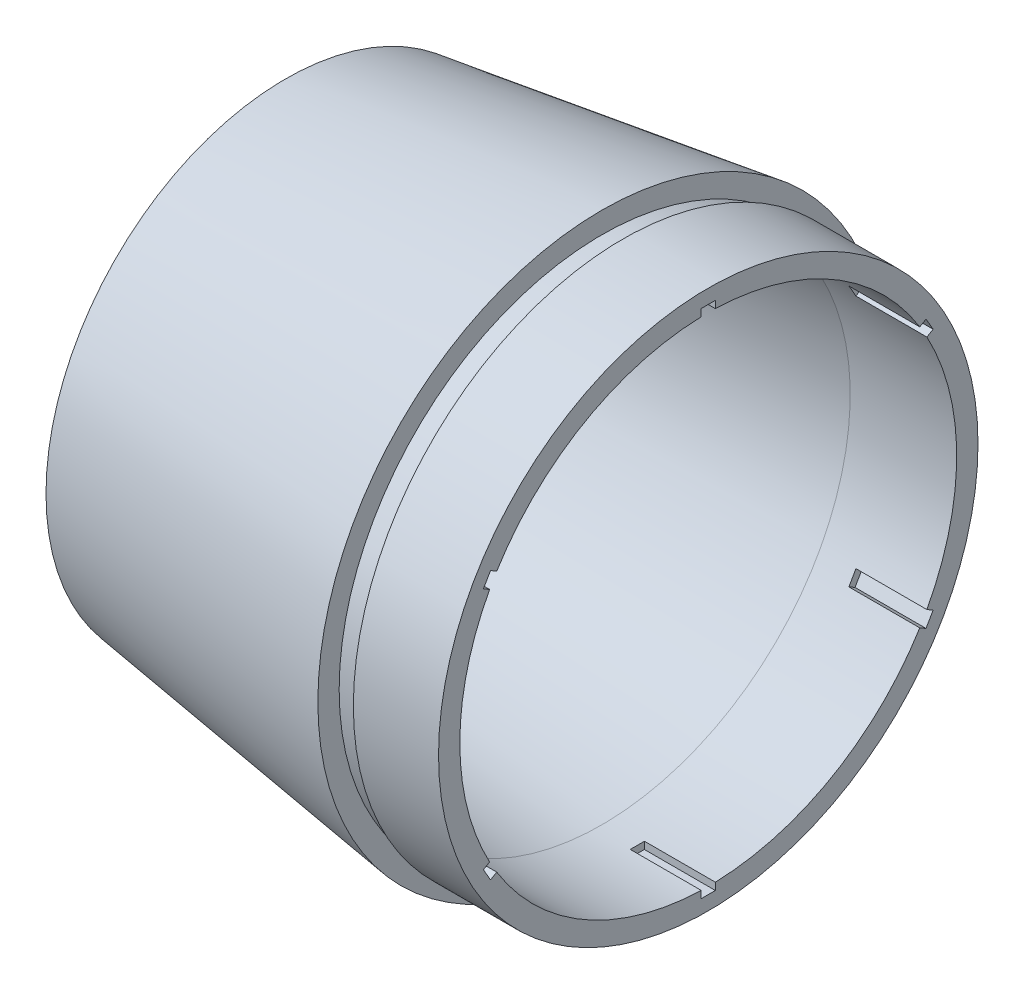
ISO-10303-21;
HEADER;
FILE_DESCRIPTION(('STEP AP214'),'2;1');
FILE_NAME('part.step','',(''),(''),'','','');
FILE_SCHEMA(('AUTOMOTIVE_DESIGN { 1 0 10303 214 1 1 1 1 }'));
ENDSEC;
DATA;
#1=APPLICATION_CONTEXT('core data for automotive mechanical design processes');
#2=APPLICATION_PROTOCOL_DEFINITION('international standard','automotive_design',2000,#1);
#3=PRODUCT_CONTEXT('',#1,'mechanical');
#4=PRODUCT('Part','Part','',(#3));
#5=PRODUCT_RELATED_PRODUCT_CATEGORY('part','',(#4));
#6=PRODUCT_DEFINITION_FORMATION('','',#4);
#7=PRODUCT_DEFINITION_CONTEXT('part definition',#1,'design');
#8=PRODUCT_DEFINITION('design','',#6,#7);
#9=PRODUCT_DEFINITION_SHAPE('','',#8);
#10=(LENGTH_UNIT() NAMED_UNIT(*) SI_UNIT(.MILLI.,.METRE.));
#11=(NAMED_UNIT(*) PLANE_ANGLE_UNIT() SI_UNIT($,.RADIAN.));
#12=(NAMED_UNIT(*) SI_UNIT($,.STERADIAN.) SOLID_ANGLE_UNIT());
#13=UNCERTAINTY_MEASURE_WITH_UNIT(LENGTH_MEASURE(1.E-05),#10,'distance_accuracy_value','');
#14=(GEOMETRIC_REPRESENTATION_CONTEXT(3) GLOBAL_UNCERTAINTY_ASSIGNED_CONTEXT((#13)) GLOBAL_UNIT_ASSIGNED_CONTEXT((#10,
#11,#12)) REPRESENTATION_CONTEXT('',''));
#15=CARTESIAN_POINT('',(0.,0.,0.));
#16=DIRECTION('',(0.,0.,1.));
#17=DIRECTION('',(1.,0.,0.));
#18=AXIS2_PLACEMENT_3D('',#15,#16,#17);
#19=CARTESIAN_POINT('',(-44.3163488855493,0.,0.));
#20=DIRECTION('',(-1.,0.,0.));
#21=DIRECTION('',(0.,0.,1.));
#22=AXIS2_PLACEMENT_3D('',#19,#20,#21);
#23=CYLINDRICAL_SURFACE('',#22,35.);
#24=CARTESIAN_POINT('',(0.,0.,0.));
#25=DIRECTION('',(-1.,0.,0.));
#26=DIRECTION('',(0.,0.,1.));
#27=AXIS2_PLACEMENT_3D('',#24,#25,#26);
#28=CIRCLE('',#27,35.);
#29=CARTESIAN_POINT('',(0.,0.,35.));
#30=VERTEX_POINT('',#29);
#31=EDGE_CURVE('E379',#30,#30,#28,.T.);
#32=ORIENTED_EDGE('',*,*,#31,.T.);
#33=EDGE_LOOP('',(#32));
#34=FACE_BOUND('',#33,.T.);
#35=DIRECTION('',(-1.,0.,0.));
#36=VECTOR('',#35,1.);
#37=CARTESIAN_POINT('',(-44.3163488855493,-16.6268302807514,30.7985148150863));
#38=LINE('',#37,#36);
#39=CARTESIAN_POINT('',(5.,-16.6268302807514,30.7985148150863));
#40=VERTEX_POINT('',#39);
#41=CARTESIAN_POINT('',(15.,-16.6268302807514,30.7985148150863));
#42=VERTEX_POINT('',#41);
#43=EDGE_CURVE('E342',#40,#42,#38,.F.);
#44=ORIENTED_EDGE('',*,*,#43,.F.);
#45=CARTESIAN_POINT('',(5.,0.,0.));
#46=DIRECTION('',(-1.,0.,0.));
#47=DIRECTION('',(0.,0.,1.));
#48=AXIS2_PLACEMENT_3D('',#45,#46,#47);
#49=CIRCLE('',#48,35.);
#50=CARTESIAN_POINT('',(5.,-18.3588810883203,29.7985148150863));
#51=VERTEX_POINT('',#50);
#52=EDGE_CURVE('E11',#40,#51,#49,.F.);
#53=ORIENTED_EDGE('',*,*,#52,.T.);
#54=DIRECTION('',(-1.,0.,0.));
#55=VECTOR('',#54,1.);
#56=CARTESIAN_POINT('',(-44.3163488855493,-18.3588810883203,29.7985148150863));
#57=LINE('',#56,#55);
#58=CARTESIAN_POINT('',(15.,-18.3588810883203,29.7985148150863));
#59=VERTEX_POINT('',#58);
#60=EDGE_CURVE('E339',#51,#59,#57,.F.);
#61=ORIENTED_EDGE('',*,*,#60,.T.);
#62=CARTESIAN_POINT('',(15.,0.,0.));
#63=DIRECTION('',(-1.,0.,0.));
#64=DIRECTION('',(0.,0.,1.));
#65=AXIS2_PLACEMENT_3D('',#62,#63,#64);
#66=CIRCLE('',#65,35.);
#67=CARTESIAN_POINT('',(15.,-34.9857113690718,1.));
#68=VERTEX_POINT('',#67);
#69=EDGE_CURVE('E376',#68,#59,#66,.T.);
#70=ORIENTED_EDGE('',*,*,#69,.F.);
#71=DIRECTION('',(-1.,0.,0.));
#72=VECTOR('',#71,1.);
#73=CARTESIAN_POINT('',(-44.3163488855493,-34.9857113690718,1.00000000000001));
#74=LINE('',#73,#72);
#75=CARTESIAN_POINT('',(5.,-34.9857113690718,1.));
#76=VERTEX_POINT('',#75);
#77=EDGE_CURVE('E370',#76,#68,#74,.F.);
#78=ORIENTED_EDGE('',*,*,#77,.F.);
#79=CARTESIAN_POINT('',(5.,0.,0.));
#80=DIRECTION('',(-1.,0.,0.));
#81=DIRECTION('',(0.,0.,1.));
#82=AXIS2_PLACEMENT_3D('',#79,#80,#81);
#83=CIRCLE('',#82,35.);
#84=CARTESIAN_POINT('',(5.,-34.9857113690718,-0.999999999999999));
#85=VERTEX_POINT('',#84);
#86=EDGE_CURVE('E404',#76,#85,#83,.F.);
#87=ORIENTED_EDGE('',*,*,#86,.T.);
#88=DIRECTION('',(-1.,0.,0.));
#89=VECTOR('',#88,1.);
#90=CARTESIAN_POINT('',(-44.3163488855493,-34.9857113690718,-0.999999999999992));
#91=LINE('',#90,#89);
#92=CARTESIAN_POINT('',(15.,-34.9857113690718,-1.));
#93=VERTEX_POINT('',#92);
#94=EDGE_CURVE('E367',#85,#93,#91,.F.);
#95=ORIENTED_EDGE('',*,*,#94,.T.);
#96=CARTESIAN_POINT('',(15.,-18.3588810883205,-29.7985148150862));
#97=VERTEX_POINT('',#96);
#98=EDGE_CURVE('E375',#97,#93,#66,.T.);
#99=ORIENTED_EDGE('',*,*,#98,.F.);
#100=DIRECTION('',(-1.,0.,0.));
#101=VECTOR('',#100,1.);
#102=CARTESIAN_POINT('',(-44.3163488855493,-18.3588810883205,-29.7985148150862));
#103=LINE('',#102,#101);
#104=CARTESIAN_POINT('',(5.,-18.3588810883205,-29.7985148150862));
#105=VERTEX_POINT('',#104);
#106=EDGE_CURVE('E332',#97,#105,#103,.T.);
#107=ORIENTED_EDGE('',*,*,#106,.T.);
#108=CARTESIAN_POINT('',(5.,-16.6268302807518,-30.798514815086));
#109=VERTEX_POINT('',#108);
#110=EDGE_CURVE('E47',#105,#109,#49,.F.);
#111=ORIENTED_EDGE('',*,*,#110,.T.);
#112=DIRECTION('',(-1.,0.,0.));
#113=VECTOR('',#112,1.);
#114=CARTESIAN_POINT('',(-44.3163488855493,-16.6268302807518,-30.798514815086));
#115=LINE('',#114,#113);
#116=CARTESIAN_POINT('',(15.,-16.6268302807518,-30.798514815086));
#117=VERTEX_POINT('',#116);
#118=EDGE_CURVE('E319',#109,#117,#115,.F.);
#119=ORIENTED_EDGE('',*,*,#118,.T.);
#120=CARTESIAN_POINT('',(15.,16.6268302807512,-30.7985148150864));
#121=VERTEX_POINT('',#120);
#122=EDGE_CURVE('E835',#121,#117,#66,.T.);
#123=ORIENTED_EDGE('',*,*,#122,.F.);
#124=DIRECTION('',(-1.,0.,0.));
#125=VECTOR('',#124,1.);
#126=CARTESIAN_POINT('',(-44.3163488855493,16.6268302807512,-30.7985148150864));
#127=LINE('',#126,#125);
#128=CARTESIAN_POINT('',(5.,16.6268302807512,-30.7985148150864));
#129=VERTEX_POINT('',#128);
#130=EDGE_CURVE('E322',#129,#121,#127,.F.);
#131=ORIENTED_EDGE('',*,*,#130,.F.);
#132=CARTESIAN_POINT('',(5.,18.3588810883201,-29.7985148150864));
#133=VERTEX_POINT('',#132);
#134=EDGE_CURVE('E408',#129,#133,#49,.F.);
#135=ORIENTED_EDGE('',*,*,#134,.T.);
#136=DIRECTION('',(-1.,0.,0.));
#137=VECTOR('',#136,1.);
#138=CARTESIAN_POINT('',(-44.3163488855493,18.3588810883201,-29.7985148150864));
#139=LINE('',#138,#137);
#140=CARTESIAN_POINT('',(15.,18.3588810883201,-29.7985148150864));
#141=VERTEX_POINT('',#140);
#142=EDGE_CURVE('E324',#133,#141,#139,.F.);
#143=ORIENTED_EDGE('',*,*,#142,.T.);
#144=CARTESIAN_POINT('',(15.,34.9857113690718,-1.));
#145=VERTEX_POINT('',#144);
#146=EDGE_CURVE('E832',#145,#141,#66,.T.);
#147=ORIENTED_EDGE('',*,*,#146,.F.);
#148=DIRECTION('',(-1.,0.,0.));
#149=VECTOR('',#148,1.);
#150=CARTESIAN_POINT('',(-44.3163488855493,34.9857113690718,-1.00000000000001));
#151=LINE('',#150,#149);
#152=CARTESIAN_POINT('',(5.,34.9857113690718,-1.));
#153=VERTEX_POINT('',#152);
#154=EDGE_CURVE('E327',#153,#145,#151,.F.);
#155=ORIENTED_EDGE('',*,*,#154,.F.);
#156=CARTESIAN_POINT('',(5.,34.9857113690718,0.999999999999999));
#157=VERTEX_POINT('',#156);
#158=EDGE_CURVE('E411',#153,#157,#49,.F.);
#159=ORIENTED_EDGE('',*,*,#158,.T.);
#160=DIRECTION('',(-1.,0.,0.));
#161=VECTOR('',#160,1.);
#162=CARTESIAN_POINT('',(-44.3163488855493,34.9857113690718,0.999999999999992));
#163=LINE('',#162,#161);
#164=CARTESIAN_POINT('',(15.,34.9857113690718,1.));
#165=VERTEX_POINT('',#164);
#166=EDGE_CURVE('E329',#157,#165,#163,.F.);
#167=ORIENTED_EDGE('',*,*,#166,.T.);
#168=CARTESIAN_POINT('',(15.,18.3588810883205,29.7985148150862));
#169=VERTEX_POINT('',#168);
#170=EDGE_CURVE('E831',#169,#165,#66,.T.);
#171=ORIENTED_EDGE('',*,*,#170,.F.);
#172=DIRECTION('',(-1.,0.,0.));
#173=VECTOR('',#172,1.);
#174=CARTESIAN_POINT('',(-44.3163488855493,18.3588810883205,29.7985148150862));
#175=LINE('',#174,#173);
#176=CARTESIAN_POINT('',(5.,18.3588810883205,29.7985148150862));
#177=VERTEX_POINT('',#176);
#178=EDGE_CURVE('E334',#177,#169,#175,.F.);
#179=ORIENTED_EDGE('',*,*,#178,.F.);
#180=CARTESIAN_POINT('',(5.,16.6268302807516,30.7985148150862));
#181=VERTEX_POINT('',#180);
#182=EDGE_CURVE('E52',#177,#181,#49,.F.);
#183=ORIENTED_EDGE('',*,*,#182,.T.);
#184=DIRECTION('',(-1.,0.,0.));
#185=VECTOR('',#184,1.);
#186=CARTESIAN_POINT('',(-44.3163488855493,16.6268302807516,30.7985148150862));
#187=LINE('',#186,#185);
#188=CARTESIAN_POINT('',(15.,16.6268302807516,30.7985148150862));
#189=VERTEX_POINT('',#188);
#190=EDGE_CURVE('E336',#181,#189,#187,.F.);
#191=ORIENTED_EDGE('',*,*,#190,.T.);
#192=EDGE_CURVE('E380',#42,#189,#66,.T.);
#193=ORIENTED_EDGE('',*,*,#192,.F.);
#194=EDGE_LOOP('',(#44,#53,#61,#70,#78,#87,#95,#99,#107,#111,#119,#123,#131,#135,#143,#147,#155,
#159,#167,#171,#179,#183,#191,#193));
#195=FACE_BOUND('',#194,.T.);
#196=ADVANCED_FACE('F43',(#34,#195),#23,.F.);
#197=CARTESIAN_POINT('',(15.,0.,0.));
#198=DIRECTION('',(-1.,0.,0.));
#199=DIRECTION('',(0.,0.,1.));
#200=AXIS2_PLACEMENT_3D('',#197,#198,#199);
#201=PLANE('',#200);
#202=CARTESIAN_POINT('',(15.,0.,0.));
#203=DIRECTION('',(-1.,0.,0.));
#204=DIRECTION('',(0.,0.,1.));
#205=AXIS2_PLACEMENT_3D('',#202,#203,#204);
#206=CIRCLE('',#205,38.);
#207=CARTESIAN_POINT('',(15.,0.,38.));
#208=VERTEX_POINT('',#207);
#209=EDGE_CURVE('E372',#208,#208,#206,.T.);
#210=ORIENTED_EDGE('',*,*,#209,.F.);
#211=EDGE_LOOP('',(#210));
#212=FACE_BOUND('',#211,.T.);
#213=DIRECTION('',(0.,0.499999999999998,-0.86602540378444));
#214=VECTOR('',#213,1.);
#215=CARTESIAN_POINT('',(15.,-17.1339745962155,31.6769145362398));
#216=LINE('',#215,#214);
#217=CARTESIAN_POINT('',(15.,-17.1339745962155,31.6769145362398));
#218=VERTEX_POINT('',#217);
#219=EDGE_CURVE('E308',#218,#42,#216,.T.);
#220=ORIENTED_EDGE('',*,*,#219,.T.);
#221=ORIENTED_EDGE('',*,*,#192,.T.);
#222=DIRECTION('',(0.,-0.500000000000004,-0.866025403784436));
#223=VECTOR('',#222,1.);
#224=CARTESIAN_POINT('',(15.,17.1339745962157,31.6769145362397));
#225=LINE('',#224,#223);
#226=CARTESIAN_POINT('',(15.,17.1339745962157,31.6769145362397));
#227=VERTEX_POINT('',#226);
#228=EDGE_CURVE('E218',#227,#189,#225,.T.);
#229=ORIENTED_EDGE('',*,*,#228,.F.);
#230=DIRECTION('',(0.,-0.866025403784436,0.500000000000004));
#231=VECTOR('',#230,1.);
#232=CARTESIAN_POINT('',(15.,18.8660254037846,30.6769145362397));
#233=LINE('',#232,#231);
#234=CARTESIAN_POINT('',(15.,18.8660254037846,30.6769145362397));
#235=VERTEX_POINT('',#234);
#236=EDGE_CURVE('E290',#235,#227,#233,.T.);
#237=ORIENTED_EDGE('',*,*,#236,.F.);
#238=DIRECTION('',(0.,-0.500000000000004,-0.866025403784436));
#239=VECTOR('',#238,1.);
#240=CARTESIAN_POINT('',(15.,18.8660254037846,30.6769145362397));
#241=LINE('',#240,#239);
#242=EDGE_CURVE('E292',#235,#169,#241,.T.);
#243=ORIENTED_EDGE('',*,*,#242,.T.);
#244=ORIENTED_EDGE('',*,*,#170,.T.);
#245=DIRECTION('',(0.,-1.,0.));
#246=VECTOR('',#245,1.);
#247=CARTESIAN_POINT('',(15.,36.,1.));
#248=LINE('',#247,#246);
#249=CARTESIAN_POINT('',(15.,36.,1.));
#250=VERTEX_POINT('',#249);
#251=EDGE_CURVE('E276',#250,#165,#248,.T.);
#252=ORIENTED_EDGE('',*,*,#251,.F.);
#253=DIRECTION('',(0.,0.,1.));
#254=VECTOR('',#253,1.);
#255=CARTESIAN_POINT('',(15.,36.,-1.));
#256=LINE('',#255,#254);
#257=CARTESIAN_POINT('',(15.,36.,-1.));
#258=VERTEX_POINT('',#257);
#259=EDGE_CURVE('E270',#258,#250,#256,.T.);
#260=ORIENTED_EDGE('',*,*,#259,.F.);
#261=DIRECTION('',(0.,-1.,0.));
#262=VECTOR('',#261,1.);
#263=CARTESIAN_POINT('',(15.,36.,-1.));
#264=LINE('',#263,#262);
#265=EDGE_CURVE('E273',#258,#145,#264,.T.);
#266=ORIENTED_EDGE('',*,*,#265,.T.);
#267=ORIENTED_EDGE('',*,*,#146,.T.);
#268=DIRECTION('',(0.,-0.499999999999992,0.866025403784443));
#269=VECTOR('',#268,1.);
#270=CARTESIAN_POINT('',(15.,18.8660254037841,-30.67691453624));
#271=LINE('',#270,#269);
#272=CARTESIAN_POINT('',(15.,18.8660254037841,-30.67691453624));
#273=VERTEX_POINT('',#272);
#274=EDGE_CURVE('E254',#273,#141,#271,.T.);
#275=ORIENTED_EDGE('',*,*,#274,.F.);
#276=DIRECTION('',(0.,0.866025403784443,0.499999999999992));
#277=VECTOR('',#276,1.);
#278=CARTESIAN_POINT('',(15.,17.1339745962153,-31.6769145362399));
#279=LINE('',#278,#277);
#280=CARTESIAN_POINT('',(15.,17.1339745962153,-31.6769145362399));
#281=VERTEX_POINT('',#280);
#282=EDGE_CURVE('E248',#281,#273,#279,.T.);
#283=ORIENTED_EDGE('',*,*,#282,.F.);
#284=DIRECTION('',(0.,-0.499999999999992,0.866025403784443));
#285=VECTOR('',#284,1.);
#286=CARTESIAN_POINT('',(15.,17.1339745962153,-31.6769145362399));
#287=LINE('',#286,#285);
#288=EDGE_CURVE('E251',#281,#121,#287,.T.);
#289=ORIENTED_EDGE('',*,*,#288,.T.);
#290=ORIENTED_EDGE('',*,*,#122,.T.);
#291=DIRECTION('',(0.,0.50000000000001,0.866025403784433));
#292=VECTOR('',#291,1.);
#293=CARTESIAN_POINT('',(15.,-17.1339745962159,-31.6769145362396));
#294=LINE('',#293,#292);
#295=CARTESIAN_POINT('',(15.,-17.1339745962159,-31.6769145362396));
#296=VERTEX_POINT('',#295);
#297=EDGE_CURVE('E236',#296,#117,#294,.T.);
#298=ORIENTED_EDGE('',*,*,#297,.F.);
#299=DIRECTION('',(0.,0.866025403784433,-0.50000000000001));
#300=VECTOR('',#299,1.);
#301=CARTESIAN_POINT('',(15.,-18.8660254037848,-30.6769145362396));
#302=LINE('',#301,#300);
#303=CARTESIAN_POINT('',(15.,-18.8660254037848,-30.6769145362396));
#304=VERTEX_POINT('',#303);
#305=EDGE_CURVE('E232',#304,#296,#302,.T.);
#306=ORIENTED_EDGE('',*,*,#305,.F.);
#307=DIRECTION('',(0.,0.500000000000004,0.866025403784436));
#308=VECTOR('',#307,1.);
#309=CARTESIAN_POINT('',(15.,-0.86602540378444,0.500000000000006));
#310=LINE('',#309,#308);
#311=EDGE_CURVE('E224',#304,#97,#310,.T.);
#312=ORIENTED_EDGE('',*,*,#311,.T.);
#313=ORIENTED_EDGE('',*,*,#98,.T.);
#314=DIRECTION('',(0.,1.,0.));
#315=VECTOR('',#314,1.);
#316=CARTESIAN_POINT('',(15.,-36.,-1.));
#317=LINE('',#316,#315);
#318=CARTESIAN_POINT('',(15.,-36.,-1.));
#319=VERTEX_POINT('',#318);
#320=EDGE_CURVE('E358',#319,#93,#317,.T.);
#321=ORIENTED_EDGE('',*,*,#320,.F.);
#322=DIRECTION('',(0.,0.,-1.));
#323=VECTOR('',#322,1.);
#324=CARTESIAN_POINT('',(15.,-36.,1.));
#325=LINE('',#324,#323);
#326=CARTESIAN_POINT('',(15.,-36.,1.));
#327=VERTEX_POINT('',#326);
#328=EDGE_CURVE('E352',#327,#319,#325,.T.);
#329=ORIENTED_EDGE('',*,*,#328,.F.);
#330=DIRECTION('',(0.,1.,0.));
#331=VECTOR('',#330,1.);
#332=CARTESIAN_POINT('',(15.,-36.,1.));
#333=LINE('',#332,#331);
#334=EDGE_CURVE('E355',#327,#68,#333,.T.);
#335=ORIENTED_EDGE('',*,*,#334,.T.);
#336=ORIENTED_EDGE('',*,*,#69,.T.);
#337=DIRECTION('',(0.,0.499999999999998,-0.86602540378444));
#338=VECTOR('',#337,1.);
#339=CARTESIAN_POINT('',(15.,-18.8660254037844,30.6769145362398));
#340=LINE('',#339,#338);
#341=CARTESIAN_POINT('',(15.,-18.8660254037844,30.6769145362398));
#342=VERTEX_POINT('',#341);
#343=EDGE_CURVE('E311',#342,#59,#340,.T.);
#344=ORIENTED_EDGE('',*,*,#343,.F.);
#345=DIRECTION('',(0.,-0.86602540378444,-0.499999999999998));
#346=VECTOR('',#345,1.);
#347=CARTESIAN_POINT('',(15.,-17.1339745962155,31.6769145362398));
#348=LINE('',#347,#346);
#349=EDGE_CURVE('E306',#218,#342,#348,.T.);
#350=ORIENTED_EDGE('',*,*,#349,.F.);
#351=EDGE_LOOP('',(#220,#221,#229,#237,#243,#244,#252,#260,#266,#267,#275,#283,#289,#290,#298,
#306,#312,#313,#321,#329,#335,#336,#344,#350));
#352=FACE_BOUND('',#351,.T.);
#353=ADVANCED_FACE('F430',(#212,#352),#201,.F.);
#354=CARTESIAN_POINT('',(-44.3163488855493,0.,0.));
#355=DIRECTION('',(-1.,0.,0.));
#356=DIRECTION('',(0.,0.,1.));
#357=AXIS2_PLACEMENT_3D('',#354,#355,#356);
#358=CYLINDRICAL_SURFACE('',#357,38.);
#359=ORIENTED_EDGE('',*,*,#209,.T.);
#360=EDGE_LOOP('',(#359));
#361=FACE_BOUND('',#360,.T.);
#362=CARTESIAN_POINT('',(3.,0.,0.));
#363=DIRECTION('',(-1.,0.,0.));
#364=DIRECTION('',(0.,0.,1.));
#365=AXIS2_PLACEMENT_3D('',#362,#363,#364);
#366=CIRCLE('',#365,38.);
#367=CARTESIAN_POINT('',(3.,0.,38.));
#368=VERTEX_POINT('',#367);
#369=EDGE_CURVE('E401',#368,#368,#366,.T.);
#370=ORIENTED_EDGE('',*,*,#369,.F.);
#371=EDGE_LOOP('',(#370));
#372=FACE_BOUND('',#371,.T.);
#373=ADVANCED_FACE('F45',(#361,#372),#358,.T.);
#374=CARTESIAN_POINT('',(3.,0.,0.));
#375=DIRECTION('',(-1.,0.,0.));
#376=DIRECTION('',(0.,0.,1.));
#377=AXIS2_PLACEMENT_3D('',#374,#375,#376);
#378=PLANE('',#377);
#379=ORIENTED_EDGE('',*,*,#369,.T.);
#380=EDGE_LOOP('',(#379));
#381=FACE_BOUND('',#380,.T.);
#382=CARTESIAN_POINT('',(3.,0.,0.));
#383=DIRECTION('',(-1.,0.,0.));
#384=DIRECTION('',(0.,0.,1.));
#385=AXIS2_PLACEMENT_3D('',#382,#383,#384);
#386=CIRCLE('',#385,37.);
#387=CARTESIAN_POINT('',(3.,0.,37.));
#388=VERTEX_POINT('',#387);
#389=EDGE_CURVE('E398',#388,#388,#386,.T.);
#390=ORIENTED_EDGE('',*,*,#389,.F.);
#391=EDGE_LOOP('',(#390));
#392=FACE_BOUND('',#391,.T.);
#393=ADVANCED_FACE('F481',(#381,#392),#378,.T.);
#394=CARTESIAN_POINT('',(-44.3163488855493,0.,0.));
#395=DIRECTION('',(-1.,0.,0.));
#396=DIRECTION('',(0.,0.,1.));
#397=AXIS2_PLACEMENT_3D('',#394,#395,#396);
#398=CYLINDRICAL_SURFACE('',#397,37.);
#399=ORIENTED_EDGE('',*,*,#389,.T.);
#400=EDGE_LOOP('',(#399));
#401=FACE_BOUND('',#400,.T.);
#402=CARTESIAN_POINT('',(0.,0.,0.));
#403=DIRECTION('',(-1.,0.,0.));
#404=DIRECTION('',(0.,0.,1.));
#405=AXIS2_PLACEMENT_3D('',#402,#403,#404);
#406=CIRCLE('',#405,37.);
#407=CARTESIAN_POINT('',(0.,0.,37.));
#408=VERTEX_POINT('',#407);
#409=EDGE_CURVE('E395',#408,#408,#406,.T.);
#410=ORIENTED_EDGE('',*,*,#409,.F.);
#411=EDGE_LOOP('',(#410));
#412=FACE_BOUND('',#411,.T.);
#413=ADVANCED_FACE('F478',(#401,#412),#398,.T.);
#414=CARTESIAN_POINT('',(0.,0.,0.));
#415=DIRECTION('',(1.,0.,0.));
#416=DIRECTION('',(0.,0.,-1.));
#417=AXIS2_PLACEMENT_3D('',#414,#415,#416);
#418=PLANE('',#417);
#419=ORIENTED_EDGE('',*,*,#409,.T.);
#420=EDGE_LOOP('',(#419));
#421=FACE_BOUND('',#420,.T.);
#422=CARTESIAN_POINT('',(0.,0.,0.));
#423=DIRECTION('',(-1.,0.,0.));
#424=DIRECTION('',(0.,0.,1.));
#425=AXIS2_PLACEMENT_3D('',#422,#423,#424);
#426=CIRCLE('',#425,40.);
#427=CARTESIAN_POINT('',(0.,0.,40.));
#428=VERTEX_POINT('',#427);
#429=EDGE_CURVE('E392',#428,#428,#426,.T.);
#430=ORIENTED_EDGE('',*,*,#429,.F.);
#431=EDGE_LOOP('',(#430));
#432=FACE_BOUND('',#431,.T.);
#433=ADVANCED_FACE('F474',(#421,#432),#418,.T.);
#434=CARTESIAN_POINT('',(0.,0.,0.));
#435=DIRECTION('',(1.,0.,0.));
#436=DIRECTION('',(0.,0.,-1.));
#437=AXIS2_PLACEMENT_3D('',#434,#435,#436);
#438=CONICAL_SURFACE('',#437,40.,0.139626340159553);
#439=CARTESIAN_POINT('',(-44.5620630933707,0.,0.));
#440=DIRECTION('',(-1.,0.,0.));
#441=DIRECTION('',(0.,0.,1.));
#442=AXIS2_PLACEMENT_3D('',#439,#440,#441);
#443=CIRCLE('',#442,33.7372104567968);
#444=CARTESIAN_POINT('',(-44.5620630933707,0.,33.7372104567968));
#445=VERTEX_POINT('',#444);
#446=EDGE_CURVE('E389',#445,#445,#443,.T.);
#447=ORIENTED_EDGE('',*,*,#446,.F.);
#448=EDGE_LOOP('',(#447));
#449=FACE_BOUND('',#448,.T.);
#450=ORIENTED_EDGE('',*,*,#429,.T.);
#451=EDGE_LOOP('',(#450));
#452=FACE_BOUND('',#451,.T.);
#453=ADVANCED_FACE('F470',(#449,#452),#438,.T.);
#454=CARTESIAN_POINT('',(-44.5620630933707,0.,0.));
#455=DIRECTION('',(1.,0.,0.));
#456=DIRECTION('',(0.,0.,-1.));
#457=AXIS2_PLACEMENT_3D('',#454,#455,#456);
#458=PLANE('',#457);
#459=CARTESIAN_POINT('',(-44.5620630933707,0.,0.));
#460=DIRECTION('',(-1.,0.,0.));
#461=DIRECTION('',(0.,0.,1.));
#462=AXIS2_PLACEMENT_3D('',#459,#460,#461);
#463=CIRCLE('',#462,31.7372104567967);
#464=CARTESIAN_POINT('',(-44.5620630933707,0.,31.7372104567967));
#465=VERTEX_POINT('',#464);
#466=EDGE_CURVE('E386',#465,#465,#463,.T.);
#467=ORIENTED_EDGE('',*,*,#466,.F.);
#468=EDGE_LOOP('',(#467));
#469=FACE_BOUND('',#468,.T.);
#470=ORIENTED_EDGE('',*,*,#446,.T.);
#471=EDGE_LOOP('',(#470));
#472=FACE_BOUND('',#471,.T.);
#473=ADVANCED_FACE('F466',(#469,#472),#458,.F.);
#474=CARTESIAN_POINT('',(-44.3163488855493,0.,0.));
#475=DIRECTION('',(-1.,0.,0.));
#476=DIRECTION('',(0.,0.,1.));
#477=AXIS2_PLACEMENT_3D('',#474,#475,#476);
#478=CYLINDRICAL_SURFACE('',#477,31.7372104567967);
#479=ORIENTED_EDGE('',*,*,#466,.T.);
#480=EDGE_LOOP('',(#479));
#481=FACE_BOUND('',#480,.T.);
#482=CARTESIAN_POINT('',(-33.555064495604,0.,0.));
#483=DIRECTION('',(-1.,0.,0.));
#484=DIRECTION('',(0.,0.,1.));
#485=AXIS2_PLACEMENT_3D('',#482,#483,#484);
#486=CIRCLE('',#485,31.7372104567967);
#487=CARTESIAN_POINT('',(-33.555064495604,0.,31.7372104567967));
#488=VERTEX_POINT('',#487);
#489=EDGE_CURVE('E383',#488,#488,#486,.T.);
#490=ORIENTED_EDGE('',*,*,#489,.F.);
#491=EDGE_LOOP('',(#490));
#492=FACE_BOUND('',#491,.T.);
#493=ADVANCED_FACE('F462',(#481,#492),#478,.F.);
#494=CARTESIAN_POINT('',(-33.555064495604,0.,0.));
#495=DIRECTION('',(1.,0.,0.));
#496=DIRECTION('',(0.,0.,-1.));
#497=AXIS2_PLACEMENT_3D('',#494,#495,#496);
#498=CONICAL_SURFACE('',#497,31.7372104567967,0.0969321413177667);
#499=ORIENTED_EDGE('',*,*,#31,.F.);
#500=EDGE_LOOP('',(#499));
#501=FACE_BOUND('',#500,.T.);
#502=ORIENTED_EDGE('',*,*,#489,.T.);
#503=EDGE_LOOP('',(#502));
#504=FACE_BOUND('',#503,.T.);
#505=ADVANCED_FACE('F458',(#501,#504),#498,.F.);
#506=CARTESIAN_POINT('',(5.,-36.,-0.999999999999999));
#507=DIRECTION('',(-1.,0.,0.));
#508=DIRECTION('',(0.,0.,1.));
#509=AXIS2_PLACEMENT_3D('',#506,#507,#508);
#510=PLANE('',#509);
#511=DIRECTION('',(0.,1.,0.));
#512=VECTOR('',#511,1.);
#513=CARTESIAN_POINT('',(5.,-36.,1.));
#514=LINE('',#513,#512);
#515=CARTESIAN_POINT('',(5.,-36.,1.));
#516=VERTEX_POINT('',#515);
#517=EDGE_CURVE('E364',#516,#76,#514,.T.);
#518=ORIENTED_EDGE('',*,*,#517,.F.);
#519=DIRECTION('',(0.,0.,1.));
#520=VECTOR('',#519,1.);
#521=CARTESIAN_POINT('',(5.,-36.,-0.999999999999999));
#522=LINE('',#521,#520);
#523=CARTESIAN_POINT('',(5.,-36.,-0.999999999999999));
#524=VERTEX_POINT('',#523);
#525=EDGE_CURVE('E346',#524,#516,#522,.T.);
#526=ORIENTED_EDGE('',*,*,#525,.F.);
#527=DIRECTION('',(0.,1.,0.));
#528=VECTOR('',#527,1.);
#529=CARTESIAN_POINT('',(5.,-36.,-0.999999999999999));
#530=LINE('',#529,#528);
#531=EDGE_CURVE('E361',#524,#85,#530,.T.);
#532=ORIENTED_EDGE('',*,*,#531,.T.);
#533=ORIENTED_EDGE('',*,*,#86,.F.);
#534=EDGE_LOOP('',(#518,#526,#532,#533));
#535=FACE_BOUND('',#534,.T.);
#536=ADVANCED_FACE('F461',(#535),#510,.F.);
#537=CARTESIAN_POINT('',(15.,-36.,1.));
#538=DIRECTION('',(0.,0.,-1.));
#539=DIRECTION('',(-1.,0.,0.));
#540=AXIS2_PLACEMENT_3D('',#537,#538,#539);
#541=PLANE('',#540);
#542=ORIENTED_EDGE('',*,*,#77,.T.);
#543=ORIENTED_EDGE('',*,*,#334,.F.);
#544=DIRECTION('',(-1.,0.,0.));
#545=VECTOR('',#544,1.);
#546=CARTESIAN_POINT('',(15.,-36.,1.));
#547=LINE('',#546,#545);
#548=EDGE_CURVE('E344',#327,#516,#547,.T.);
#549=ORIENTED_EDGE('',*,*,#548,.T.);
#550=ORIENTED_EDGE('',*,*,#517,.T.);
#551=EDGE_LOOP('',(#542,#543,#549,#550));
#552=FACE_BOUND('',#551,.T.);
#553=ADVANCED_FACE('F551',(#552),#541,.T.);
#554=CARTESIAN_POINT('',(15.,-36.,-1.));
#555=DIRECTION('',(0.,0.,-1.));
#556=DIRECTION('',(-1.,0.,0.));
#557=AXIS2_PLACEMENT_3D('',#554,#555,#556);
#558=PLANE('',#557);
#559=ORIENTED_EDGE('',*,*,#531,.F.);
#560=DIRECTION('',(-1.,0.,0.));
#561=VECTOR('',#560,1.);
#562=CARTESIAN_POINT('',(15.,-36.,-1.));
#563=LINE('',#562,#561);
#564=EDGE_CURVE('E349',#319,#524,#563,.T.);
#565=ORIENTED_EDGE('',*,*,#564,.F.);
#566=ORIENTED_EDGE('',*,*,#320,.T.);
#567=ORIENTED_EDGE('',*,*,#94,.F.);
#568=EDGE_LOOP('',(#559,#565,#566,#567));
#569=FACE_BOUND('',#568,.T.);
#570=ADVANCED_FACE('F561',(#569),#558,.F.);
#571=CARTESIAN_POINT('',(0.,-36.,0.));
#572=DIRECTION('',(0.,1.,0.));
#573=DIRECTION('',(0.,0.,1.));
#574=AXIS2_PLACEMENT_3D('',#571,#572,#573);
#575=PLANE('',#574);
#576=ORIENTED_EDGE('',*,*,#548,.F.);
#577=ORIENTED_EDGE('',*,*,#328,.T.);
#578=ORIENTED_EDGE('',*,*,#564,.T.);
#579=ORIENTED_EDGE('',*,*,#525,.T.);
#580=EDGE_LOOP('',(#576,#577,#578,#579));
#581=FACE_BOUND('',#580,.T.);
#582=ADVANCED_FACE('F570',(#581),#575,.T.);
#583=CARTESIAN_POINT('',(0.,-18.0000000000004,-31.1769145362396));
#584=DIRECTION('',(0.,0.50000000000001,0.866025403784433));
#585=DIRECTION('',(0.,-0.866025403784433,0.50000000000001));
#586=AXIS2_PLACEMENT_3D('',#583,#584,#585);
#587=PLANE('',#586);
#588=DIRECTION('',(-1.,0.,0.));
#589=VECTOR('',#588,1.);
#590=CARTESIAN_POINT('',(15.,-18.8660254037848,-30.6769145362396));
#591=LINE('',#590,#589);
#592=CARTESIAN_POINT('',(5.,-18.8660254037848,-30.6769145362396));
#593=VERTEX_POINT('',#592);
#594=EDGE_CURVE('E221',#304,#593,#591,.T.);
#595=ORIENTED_EDGE('',*,*,#594,.F.);
#596=ORIENTED_EDGE('',*,*,#305,.T.);
#597=DIRECTION('',(-1.,0.,0.));
#598=VECTOR('',#597,1.);
#599=CARTESIAN_POINT('',(15.,-17.1339745962159,-31.6769145362396));
#600=LINE('',#599,#598);
#601=CARTESIAN_POINT('',(5.,-17.1339745962159,-31.6769145362396));
#602=VERTEX_POINT('',#601);
#603=EDGE_CURVE('E230',#296,#602,#600,.T.);
#604=ORIENTED_EDGE('',*,*,#603,.T.);
#605=DIRECTION('',(0.,-0.866025403784433,0.50000000000001));
#606=VECTOR('',#605,1.);
#607=CARTESIAN_POINT('',(5.,-17.1339745962159,-31.6769145362396));
#608=LINE('',#607,#606);
#609=EDGE_CURVE('E212',#602,#593,#608,.T.);
#610=ORIENTED_EDGE('',*,*,#609,.T.);
#611=EDGE_LOOP('',(#595,#596,#604,#610));
#612=FACE_BOUND('',#611,.T.);
#613=ADVANCED_FACE('F229',(#612),#587,.T.);
#614=CARTESIAN_POINT('',(15.,-17.1339745962159,-31.6769145362396));
#615=DIRECTION('',(0.,0.866025403784433,-0.50000000000001));
#616=DIRECTION('',(0.,0.50000000000001,0.866025403784433));
#617=AXIS2_PLACEMENT_3D('',#614,#615,#616);
#618=PLANE('',#617);
#619=DIRECTION('',(0.,0.50000000000001,0.866025403784433));
#620=VECTOR('',#619,1.);
#621=CARTESIAN_POINT('',(5.,-17.1339745962159,-31.6769145362396));
#622=LINE('',#621,#620);
#623=EDGE_CURVE('E238',#602,#109,#622,.T.);
#624=ORIENTED_EDGE('',*,*,#623,.F.);
#625=ORIENTED_EDGE('',*,*,#603,.F.);
#626=ORIENTED_EDGE('',*,*,#297,.T.);
#627=ORIENTED_EDGE('',*,*,#118,.F.);
#628=EDGE_LOOP('',(#624,#625,#626,#627));
#629=FACE_BOUND('',#628,.T.);
#630=ADVANCED_FACE('F446',(#629),#618,.F.);
#631=CARTESIAN_POINT('',(15.,17.1339745962157,31.6769145362397));
#632=DIRECTION('',(0.,-0.866025403784436,0.500000000000004));
#633=DIRECTION('',(0.,-0.500000000000004,-0.866025403784436));
#634=AXIS2_PLACEMENT_3D('',#631,#632,#633);
#635=PLANE('',#634);
#636=ORIENTED_EDGE('',*,*,#311,.F.);
#637=ORIENTED_EDGE('',*,*,#594,.T.);
#638=DIRECTION('',(0.,-0.500000000000004,-0.866025403784436));
#639=VECTOR('',#638,1.);
#640=CARTESIAN_POINT('',(5.,17.1339745962157,31.6769145362397));
#641=LINE('',#640,#639);
#642=EDGE_CURVE('E207',#105,#593,#641,.T.);
#643=ORIENTED_EDGE('',*,*,#642,.F.);
#644=ORIENTED_EDGE('',*,*,#106,.F.);
#645=EDGE_LOOP('',(#636,#637,#643,#644));
#646=FACE_BOUND('',#645,.T.);
#647=ADVANCED_FACE('F222',(#646),#635,.F.);
#648=CARTESIAN_POINT('',(5.,-18.8660254037844,30.6769145362398));
#649=DIRECTION('',(-1.,0.,0.));
#650=DIRECTION('',(0.,0.,1.));
#651=AXIS2_PLACEMENT_3D('',#648,#649,#650);
#652=PLANE('',#651);
#653=ORIENTED_EDGE('',*,*,#642,.T.);
#654=ORIENTED_EDGE('',*,*,#609,.F.);
#655=ORIENTED_EDGE('',*,*,#623,.T.);
#656=ORIENTED_EDGE('',*,*,#110,.F.);
#657=EDGE_LOOP('',(#653,#654,#655,#656));
#658=FACE_BOUND('',#657,.T.);
#659=ADVANCED_FACE('F209',(#658),#652,.F.);
#660=CARTESIAN_POINT('',(0.,17.9999999999997,-31.17691453624));
#661=DIRECTION('',(0.,-0.499999999999992,0.866025403784443));
#662=DIRECTION('',(0.,-0.866025403784443,-0.499999999999992));
#663=AXIS2_PLACEMENT_3D('',#660,#661,#662);
#664=PLANE('',#663);
#665=DIRECTION('',(-1.,0.,0.));
#666=VECTOR('',#665,1.);
#667=CARTESIAN_POINT('',(15.,17.1339745962153,-31.6769145362399));
#668=LINE('',#667,#666);
#669=CARTESIAN_POINT('',(5.,17.1339745962153,-31.6769145362399));
#670=VERTEX_POINT('',#669);
#671=EDGE_CURVE('E240',#281,#670,#668,.T.);
#672=ORIENTED_EDGE('',*,*,#671,.F.);
#673=ORIENTED_EDGE('',*,*,#282,.T.);
#674=DIRECTION('',(-1.,0.,0.));
#675=VECTOR('',#674,1.);
#676=CARTESIAN_POINT('',(15.,18.8660254037841,-30.67691453624));
#677=LINE('',#676,#675);
#678=CARTESIAN_POINT('',(5.,18.8660254037841,-30.67691453624));
#679=VERTEX_POINT('',#678);
#680=EDGE_CURVE('E245',#273,#679,#677,.T.);
#681=ORIENTED_EDGE('',*,*,#680,.T.);
#682=DIRECTION('',(0.,-0.866025403784443,-0.499999999999992));
#683=VECTOR('',#682,1.);
#684=CARTESIAN_POINT('',(5.,18.8660254037841,-30.67691453624));
#685=LINE('',#684,#683);
#686=EDGE_CURVE('E242',#679,#670,#685,.T.);
#687=ORIENTED_EDGE('',*,*,#686,.T.);
#688=EDGE_LOOP('',(#672,#673,#681,#687));
#689=FACE_BOUND('',#688,.T.);
#690=ADVANCED_FACE('F624',(#689),#664,.T.);
#691=CARTESIAN_POINT('',(15.,17.1339745962153,-31.6769145362399));
#692=DIRECTION('',(0.,0.866025403784443,0.499999999999992));
#693=DIRECTION('',(0.,-0.499999999999992,0.866025403784443));
#694=AXIS2_PLACEMENT_3D('',#691,#692,#693);
#695=PLANE('',#694);
#696=ORIENTED_EDGE('',*,*,#130,.T.);
#697=ORIENTED_EDGE('',*,*,#288,.F.);
#698=ORIENTED_EDGE('',*,*,#671,.T.);
#699=DIRECTION('',(0.,-0.499999999999992,0.866025403784443));
#700=VECTOR('',#699,1.);
#701=CARTESIAN_POINT('',(5.,17.1339745962153,-31.6769145362399));
#702=LINE('',#701,#700);
#703=EDGE_CURVE('E259',#670,#129,#702,.T.);
#704=ORIENTED_EDGE('',*,*,#703,.T.);
#705=EDGE_LOOP('',(#696,#697,#698,#704));
#706=FACE_BOUND('',#705,.T.);
#707=ADVANCED_FACE('F645',(#706),#695,.T.);
#708=CARTESIAN_POINT('',(15.,18.8660254037841,-30.67691453624));
#709=DIRECTION('',(0.,0.866025403784443,0.499999999999992));
#710=DIRECTION('',(0.,-0.499999999999992,0.866025403784443));
#711=AXIS2_PLACEMENT_3D('',#708,#709,#710);
#712=PLANE('',#711);
#713=DIRECTION('',(0.,-0.499999999999992,0.866025403784443));
#714=VECTOR('',#713,1.);
#715=CARTESIAN_POINT('',(5.,18.8660254037841,-30.67691453624));
#716=LINE('',#715,#714);
#717=EDGE_CURVE('E256',#679,#133,#716,.T.);
#718=ORIENTED_EDGE('',*,*,#717,.F.);
#719=ORIENTED_EDGE('',*,*,#680,.F.);
#720=ORIENTED_EDGE('',*,*,#274,.T.);
#721=ORIENTED_EDGE('',*,*,#142,.F.);
#722=EDGE_LOOP('',(#718,#719,#720,#721));
#723=FACE_BOUND('',#722,.T.);
#724=ADVANCED_FACE('F655',(#723),#712,.F.);
#725=ORIENTED_EDGE('',*,*,#703,.F.);
#726=ORIENTED_EDGE('',*,*,#686,.F.);
#727=ORIENTED_EDGE('',*,*,#717,.T.);
#728=ORIENTED_EDGE('',*,*,#134,.F.);
#729=EDGE_LOOP('',(#725,#726,#727,#728));
#730=FACE_BOUND('',#729,.T.);
#731=ADVANCED_FACE('F625',(#730),#652,.F.);
#732=CARTESIAN_POINT('',(0.,36.,0.));
#733=DIRECTION('',(0.,-1.,0.));
#734=DIRECTION('',(0.,0.,-1.));
#735=AXIS2_PLACEMENT_3D('',#732,#733,#734);
#736=PLANE('',#735);
#737=DIRECTION('',(-1.,0.,0.));
#738=VECTOR('',#737,1.);
#739=CARTESIAN_POINT('',(15.,36.,-1.));
#740=LINE('',#739,#738);
#741=CARTESIAN_POINT('',(5.,36.,-1.));
#742=VERTEX_POINT('',#741);
#743=EDGE_CURVE('E262',#258,#742,#740,.T.);
#744=ORIENTED_EDGE('',*,*,#743,.F.);
#745=ORIENTED_EDGE('',*,*,#259,.T.);
#746=DIRECTION('',(-1.,0.,0.));
#747=VECTOR('',#746,1.);
#748=CARTESIAN_POINT('',(15.,36.,1.));
#749=LINE('',#748,#747);
#750=CARTESIAN_POINT('',(5.,36.,0.999999999999999));
#751=VERTEX_POINT('',#750);
#752=EDGE_CURVE('E267',#250,#751,#749,.T.);
#753=ORIENTED_EDGE('',*,*,#752,.T.);
#754=DIRECTION('',(0.,0.,-1.));
#755=VECTOR('',#754,1.);
#756=CARTESIAN_POINT('',(5.,36.,0.999999999999999));
#757=LINE('',#756,#755);
#758=EDGE_CURVE('E264',#751,#742,#757,.T.);
#759=ORIENTED_EDGE('',*,*,#758,.T.);
#760=EDGE_LOOP('',(#744,#745,#753,#759));
#761=FACE_BOUND('',#760,.T.);
#762=ADVANCED_FACE('F674',(#761),#736,.T.);
#763=CARTESIAN_POINT('',(15.,36.,-1.));
#764=DIRECTION('',(0.,0.,1.));
#765=DIRECTION('',(1.,0.,0.));
#766=AXIS2_PLACEMENT_3D('',#763,#764,#765);
#767=PLANE('',#766);
#768=ORIENTED_EDGE('',*,*,#154,.T.);
#769=ORIENTED_EDGE('',*,*,#265,.F.);
#770=ORIENTED_EDGE('',*,*,#743,.T.);
#771=DIRECTION('',(0.,-1.,0.));
#772=VECTOR('',#771,1.);
#773=CARTESIAN_POINT('',(5.,36.,-1.));
#774=LINE('',#773,#772);
#775=EDGE_CURVE('E281',#742,#153,#774,.T.);
#776=ORIENTED_EDGE('',*,*,#775,.T.);
#777=EDGE_LOOP('',(#768,#769,#770,#776));
#778=FACE_BOUND('',#777,.T.);
#779=ADVANCED_FACE('F695',(#778),#767,.T.);
#780=CARTESIAN_POINT('',(15.,36.,1.));
#781=DIRECTION('',(0.,0.,1.));
#782=DIRECTION('',(1.,0.,0.));
#783=AXIS2_PLACEMENT_3D('',#780,#781,#782);
#784=PLANE('',#783);
#785=DIRECTION('',(0.,-1.,0.));
#786=VECTOR('',#785,1.);
#787=CARTESIAN_POINT('',(5.,36.,0.999999999999999));
#788=LINE('',#787,#786);
#789=EDGE_CURVE('E278',#751,#157,#788,.T.);
#790=ORIENTED_EDGE('',*,*,#789,.F.);
#791=ORIENTED_EDGE('',*,*,#752,.F.);
#792=ORIENTED_EDGE('',*,*,#251,.T.);
#793=ORIENTED_EDGE('',*,*,#166,.F.);
#794=EDGE_LOOP('',(#790,#791,#792,#793));
#795=FACE_BOUND('',#794,.T.);
#796=ADVANCED_FACE('F705',(#795),#784,.F.);
#797=ORIENTED_EDGE('',*,*,#775,.F.);
#798=ORIENTED_EDGE('',*,*,#758,.F.);
#799=ORIENTED_EDGE('',*,*,#789,.T.);
#800=ORIENTED_EDGE('',*,*,#158,.F.);
#801=EDGE_LOOP('',(#797,#798,#799,#800));
#802=FACE_BOUND('',#801,.T.);
#803=ADVANCED_FACE('F442',(#802),#652,.F.);
#804=CARTESIAN_POINT('',(0.,18.0000000000001,31.1769145362397));
#805=DIRECTION('',(0.,-0.500000000000004,-0.866025403784436));
#806=DIRECTION('',(0.,0.866025403784436,-0.500000000000004));
#807=AXIS2_PLACEMENT_3D('',#804,#805,#806);
#808=PLANE('',#807);
#809=DIRECTION('',(-1.,0.,0.));
#810=VECTOR('',#809,1.);
#811=CARTESIAN_POINT('',(15.,18.8660254037846,30.6769145362397));
#812=LINE('',#811,#810);
#813=CARTESIAN_POINT('',(5.,18.8660254037846,30.6769145362397));
#814=VERTEX_POINT('',#813);
#815=EDGE_CURVE('E67',#235,#814,#812,.T.);
#816=ORIENTED_EDGE('',*,*,#815,.F.);
#817=ORIENTED_EDGE('',*,*,#236,.T.);
#818=DIRECTION('',(-1.,0.,0.));
#819=VECTOR('',#818,1.);
#820=CARTESIAN_POINT('',(15.,17.1339745962157,31.6769145362397));
#821=LINE('',#820,#819);
#822=CARTESIAN_POINT('',(5.,17.1339745962157,31.6769145362397));
#823=VERTEX_POINT('',#822);
#824=EDGE_CURVE('E287',#227,#823,#821,.T.);
#825=ORIENTED_EDGE('',*,*,#824,.T.);
#826=DIRECTION('',(0.,0.866025403784436,-0.500000000000004));
#827=VECTOR('',#826,1.);
#828=CARTESIAN_POINT('',(5.,17.1339745962157,31.6769145362397));
#829=LINE('',#828,#827);
#830=EDGE_CURVE('E285',#823,#814,#829,.T.);
#831=ORIENTED_EDGE('',*,*,#830,.T.);
#832=EDGE_LOOP('',(#816,#817,#825,#831));
#833=FACE_BOUND('',#832,.T.);
#834=ADVANCED_FACE('F431',(#833),#808,.T.);
#835=CARTESIAN_POINT('',(15.,18.8660254037846,30.6769145362397));
#836=DIRECTION('',(0.,-0.866025403784436,0.500000000000004));
#837=DIRECTION('',(0.,-0.500000000000004,-0.866025403784436));
#838=AXIS2_PLACEMENT_3D('',#835,#836,#837);
#839=PLANE('',#838);
#840=ORIENTED_EDGE('',*,*,#178,.T.);
#841=ORIENTED_EDGE('',*,*,#242,.F.);
#842=ORIENTED_EDGE('',*,*,#815,.T.);
#843=DIRECTION('',(0.,-0.500000000000004,-0.866025403784436));
#844=VECTOR('',#843,1.);
#845=CARTESIAN_POINT('',(5.,18.8660254037846,30.6769145362397));
#846=LINE('',#845,#844);
#847=EDGE_CURVE('E297',#814,#177,#846,.T.);
#848=ORIENTED_EDGE('',*,*,#847,.T.);
#849=EDGE_LOOP('',(#840,#841,#842,#848));
#850=FACE_BOUND('',#849,.T.);
#851=ADVANCED_FACE('F426',(#850),#839,.T.);
#852=EDGE_CURVE('E217',#823,#181,#641,.T.);
#853=ORIENTED_EDGE('',*,*,#852,.F.);
#854=ORIENTED_EDGE('',*,*,#824,.F.);
#855=ORIENTED_EDGE('',*,*,#228,.T.);
#856=ORIENTED_EDGE('',*,*,#190,.F.);
#857=EDGE_LOOP('',(#853,#854,#855,#856));
#858=FACE_BOUND('',#857,.T.);
#859=ADVANCED_FACE('F433',(#858),#635,.F.);
#860=ORIENTED_EDGE('',*,*,#847,.F.);
#861=ORIENTED_EDGE('',*,*,#830,.F.);
#862=ORIENTED_EDGE('',*,*,#852,.T.);
#863=ORIENTED_EDGE('',*,*,#182,.F.);
#864=EDGE_LOOP('',(#860,#861,#862,#863));
#865=FACE_BOUND('',#864,.T.);
#866=ADVANCED_FACE('F423',(#865),#652,.F.);
#867=DIRECTION('',(0.,0.499999999999998,-0.86602540378444));
#868=VECTOR('',#867,1.);
#869=CARTESIAN_POINT('',(5.,-17.1339745962155,31.6769145362398));
#870=LINE('',#869,#868);
#871=CARTESIAN_POINT('',(5.,-17.1339745962155,31.6769145362398));
#872=VERTEX_POINT('',#871);
#873=EDGE_CURVE('E316',#872,#40,#870,.T.);
#874=ORIENTED_EDGE('',*,*,#873,.F.);
#875=DIRECTION('',(0.,0.86602540378444,0.499999999999998));
#876=VECTOR('',#875,1.);
#877=CARTESIAN_POINT('',(5.,-18.8660254037844,30.6769145362398));
#878=LINE('',#877,#876);
#879=CARTESIAN_POINT('',(5.,-18.8660254037844,30.6769145362398));
#880=VERTEX_POINT('',#879);
#881=EDGE_CURVE('E301',#880,#872,#878,.T.);
#882=ORIENTED_EDGE('',*,*,#881,.F.);
#883=DIRECTION('',(0.,0.499999999999998,-0.86602540378444));
#884=VECTOR('',#883,1.);
#885=CARTESIAN_POINT('',(5.,-18.8660254037844,30.6769145362398));
#886=LINE('',#885,#884);
#887=EDGE_CURVE('E313',#880,#51,#886,.T.);
#888=ORIENTED_EDGE('',*,*,#887,.T.);
#889=ORIENTED_EDGE('',*,*,#52,.F.);
#890=EDGE_LOOP('',(#874,#882,#888,#889));
#891=FACE_BOUND('',#890,.T.);
#892=ADVANCED_FACE('F440',(#891),#652,.F.);
#893=CARTESIAN_POINT('',(15.,-17.1339745962155,31.6769145362398));
#894=DIRECTION('',(0.,-0.86602540378444,-0.499999999999998));
#895=DIRECTION('',(0.,0.499999999999998,-0.86602540378444));
#896=AXIS2_PLACEMENT_3D('',#893,#894,#895);
#897=PLANE('',#896);
#898=ORIENTED_EDGE('',*,*,#43,.T.);
#899=ORIENTED_EDGE('',*,*,#219,.F.);
#900=DIRECTION('',(-1.,0.,0.));
#901=VECTOR('',#900,1.);
#902=CARTESIAN_POINT('',(15.,-17.1339745962155,31.6769145362398));
#903=LINE('',#902,#901);
#904=EDGE_CURVE('E59',#218,#872,#903,.T.);
#905=ORIENTED_EDGE('',*,*,#904,.T.);
#906=ORIENTED_EDGE('',*,*,#873,.T.);
#907=EDGE_LOOP('',(#898,#899,#905,#906));
#908=FACE_BOUND('',#907,.T.);
#909=ADVANCED_FACE('F782',(#908),#897,.T.);
#910=CARTESIAN_POINT('',(15.,-18.8660254037844,30.6769145362398));
#911=DIRECTION('',(0.,-0.86602540378444,-0.499999999999998));
#912=DIRECTION('',(0.,0.499999999999998,-0.86602540378444));
#913=AXIS2_PLACEMENT_3D('',#910,#911,#912);
#914=PLANE('',#913);
#915=ORIENTED_EDGE('',*,*,#887,.F.);
#916=DIRECTION('',(-1.,0.,0.));
#917=VECTOR('',#916,1.);
#918=CARTESIAN_POINT('',(15.,-18.8660254037844,30.6769145362398));
#919=LINE('',#918,#917);
#920=EDGE_CURVE('E303',#342,#880,#919,.T.);
#921=ORIENTED_EDGE('',*,*,#920,.F.);
#922=ORIENTED_EDGE('',*,*,#343,.T.);
#923=ORIENTED_EDGE('',*,*,#60,.F.);
#924=EDGE_LOOP('',(#915,#921,#922,#923));
#925=FACE_BOUND('',#924,.T.);
#926=ADVANCED_FACE('F803',(#925),#914,.F.);
#927=CARTESIAN_POINT('',(0.,-17.9999999999999,31.1769145362398));
#928=DIRECTION('',(0.,0.499999999999998,-0.86602540378444));
#929=DIRECTION('',(0.,0.86602540378444,0.499999999999998));
#930=AXIS2_PLACEMENT_3D('',#927,#928,#929);
#931=PLANE('',#930);
#932=ORIENTED_EDGE('',*,*,#904,.F.);
#933=ORIENTED_EDGE('',*,*,#349,.T.);
#934=ORIENTED_EDGE('',*,*,#920,.T.);
#935=ORIENTED_EDGE('',*,*,#881,.T.);
#936=EDGE_LOOP('',(#932,#933,#934,#935));
#937=FACE_BOUND('',#936,.T.);
#938=ADVANCED_FACE('F813',(#937),#931,.T.);
#939=CLOSED_SHELL('',(#196,#353,#373,#393,#413,#433,#453,#473,#493,#505,#536,#553,#570,#582,
#613,#630,#647,#659,#690,#707,#724,#731,#762,#779,#796,#803,#834,#851,#859,#866,#892,#909,#926,#938));
#940=MANIFOLD_SOLID_BREP('B2',#939);
#941=ADVANCED_BREP_SHAPE_REPRESENTATION('',(#18,#940),#14);
#942=SHAPE_DEFINITION_REPRESENTATION(#9,#941);
ENDSEC;
END-ISO-10303-21;
